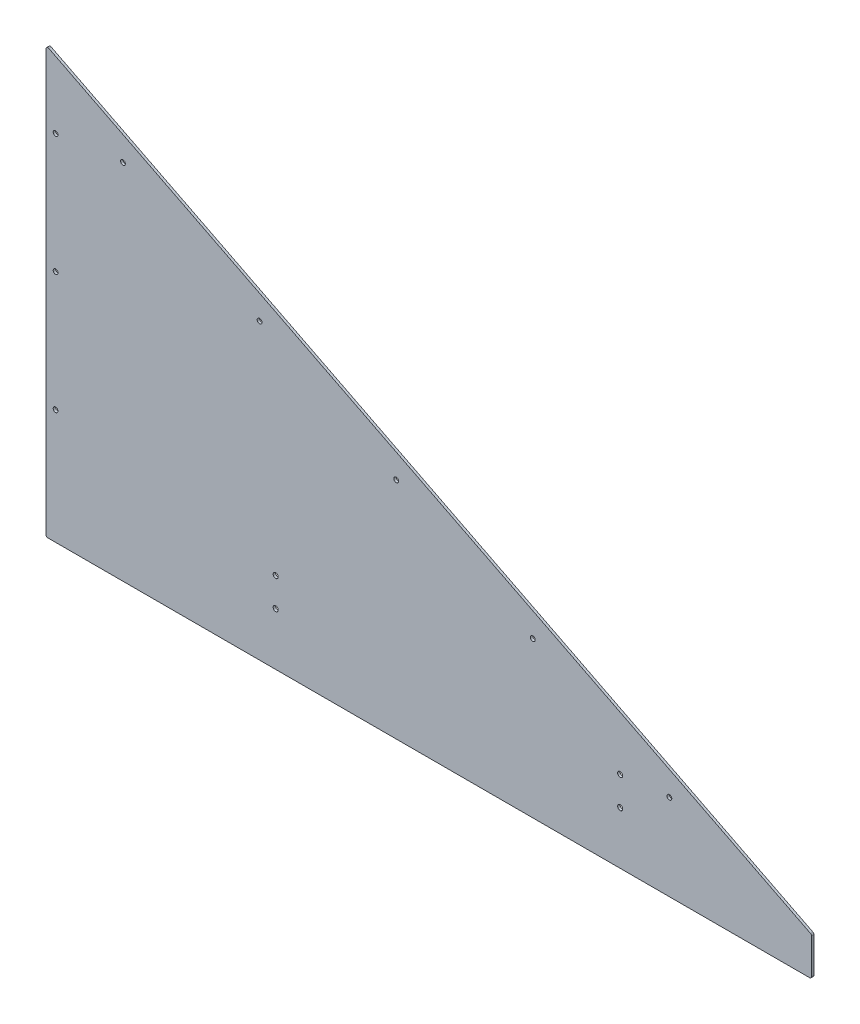
ISO-10303-21;
HEADER;
FILE_DESCRIPTION(('STEP AP214'),'2;1');
FILE_NAME('part.step','',(''),(''),'','','');
FILE_SCHEMA(('AUTOMOTIVE_DESIGN { 1 0 10303 214 1 1 1 1 }'));
ENDSEC;
DATA;
#1=APPLICATION_CONTEXT('core data for automotive mechanical design processes');
#2=APPLICATION_PROTOCOL_DEFINITION('international standard','automotive_design',2000,#1);
#3=PRODUCT_CONTEXT('',#1,'mechanical');
#4=PRODUCT('Part','Part','',(#3));
#5=PRODUCT_RELATED_PRODUCT_CATEGORY('part','',(#4));
#6=PRODUCT_DEFINITION_FORMATION('','',#4);
#7=PRODUCT_DEFINITION_CONTEXT('part definition',#1,'design');
#8=PRODUCT_DEFINITION('design','',#6,#7);
#9=PRODUCT_DEFINITION_SHAPE('','',#8);
#10=(LENGTH_UNIT() NAMED_UNIT(*) SI_UNIT(.MILLI.,.METRE.));
#11=(NAMED_UNIT(*) PLANE_ANGLE_UNIT() SI_UNIT($,.RADIAN.));
#12=(NAMED_UNIT(*) SI_UNIT($,.STERADIAN.) SOLID_ANGLE_UNIT());
#13=UNCERTAINTY_MEASURE_WITH_UNIT(LENGTH_MEASURE(1.E-05),#10,'distance_accuracy_value','');
#14=(GEOMETRIC_REPRESENTATION_CONTEXT(3) GLOBAL_UNCERTAINTY_ASSIGNED_CONTEXT((#13)) GLOBAL_UNIT_ASSIGNED_CONTEXT((#10,
#11,#12)) REPRESENTATION_CONTEXT('',''));
#15=CARTESIAN_POINT('',(0.,0.,0.));
#16=DIRECTION('',(0.,0.,1.));
#17=DIRECTION('',(1.,0.,0.));
#18=AXIS2_PLACEMENT_3D('',#15,#16,#17);
#19=CARTESIAN_POINT('',(0.,0.,3.175));
#20=DIRECTION('',(-0.451668961292938,-0.892185602553952,0.));
#21=DIRECTION('',(0.892185602553952,-0.451668961292938,0.));
#22=AXIS2_PLACEMENT_3D('',#19,#20,#21);
#23=PLANE('',#22);
#24=DIRECTION('',(-0.892185602553952,0.451668961292938,0.));
#25=VECTOR('',#24,1.);
#26=CARTESIAN_POINT('',(0.,0.,3.175));
#27=LINE('',#26,#25);
#28=CARTESIAN_POINT('',(-1.39276083831594,0.705085174397443,3.175));
#29=VERTEX_POINT('',#28);
#30=CARTESIAN_POINT('',(-1012.31276083832,512.483335174397,3.175));
#31=VERTEX_POINT('',#30);
#32=EDGE_CURVE('E123',#29,#31,#27,.T.);
#33=ORIENTED_EDGE('',*,*,#32,.F.);
#34=DIRECTION('',(0.,0.,-1.));
#35=VECTOR('',#34,1.);
#36=CARTESIAN_POINT('',(-1.39276083831594,0.705085174397443,3.175));
#37=LINE('',#36,#35);
#38=CARTESIAN_POINT('',(-1.39276083831594,0.705085174397443,0.));
#39=VERTEX_POINT('',#38);
#40=EDGE_CURVE('E107',#29,#39,#37,.T.);
#41=ORIENTED_EDGE('',*,*,#40,.T.);
#42=DIRECTION('',(-0.892185602553952,0.451668961292938,0.));
#43=VECTOR('',#42,1.);
#44=CARTESIAN_POINT('',(0.,0.,0.));
#45=LINE('',#44,#43);
#46=CARTESIAN_POINT('',(-1012.31276083832,512.483335174397,0.));
#47=VERTEX_POINT('',#46);
#48=EDGE_CURVE('E120',#39,#47,#45,.T.);
#49=ORIENTED_EDGE('',*,*,#48,.T.);
#50=DIRECTION('',(0.,0.,-1.));
#51=VECTOR('',#50,1.);
#52=CARTESIAN_POINT('',(-1012.31276083832,512.483335174397,3.175));
#53=LINE('',#52,#51);
#54=EDGE_CURVE('E126',#47,#31,#53,.F.);
#55=ORIENTED_EDGE('',*,*,#54,.T.);
#56=EDGE_LOOP('',(#33,#41,#49,#55));
#57=FACE_BOUND('',#56,.T.);
#58=ADVANCED_FACE('F36',(#57),#23,.F.);
#59=CARTESIAN_POINT('',(-1016.,514.35,3.175));
#60=DIRECTION('',(1.,0.,0.));
#61=DIRECTION('',(0.,0.,-1.));
#62=AXIS2_PLACEMENT_3D('',#59,#60,#61);
#63=PLANE('',#62);
#64=DIRECTION('',(0.,-1.,0.));
#65=VECTOR('',#64,1.);
#66=CARTESIAN_POINT('',(-1016.,514.35,0.));
#67=LINE('',#66,#65);
#68=CARTESIAN_POINT('',(-1016.,510.21718374391,0.));
#69=VERTEX_POINT('',#68);
#70=CARTESIAN_POINT('',(-1016.,-48.26,0.));
#71=VERTEX_POINT('',#70);
#72=EDGE_CURVE('E131',#69,#71,#67,.T.);
#73=ORIENTED_EDGE('',*,*,#72,.T.);
#74=DIRECTION('',(0.,0.,-1.));
#75=VECTOR('',#74,1.);
#76=CARTESIAN_POINT('',(-1016.,-48.26,3.175));
#77=LINE('',#76,#75);
#78=CARTESIAN_POINT('',(-1016.,-48.26,3.175));
#79=VERTEX_POINT('',#78);
#80=EDGE_CURVE('E11',#71,#79,#77,.F.);
#81=ORIENTED_EDGE('',*,*,#80,.T.);
#82=DIRECTION('',(0.,-1.,0.));
#83=VECTOR('',#82,1.);
#84=CARTESIAN_POINT('',(-1016.,514.35,3.175));
#85=LINE('',#84,#83);
#86=CARTESIAN_POINT('',(-1016.,510.21718374391,3.175));
#87=VERTEX_POINT('',#86);
#88=EDGE_CURVE('E190',#87,#79,#85,.T.);
#89=ORIENTED_EDGE('',*,*,#88,.F.);
#90=DIRECTION('',(0.,0.,-1.));
#91=VECTOR('',#90,1.);
#92=CARTESIAN_POINT('',(-1016.,510.21718374391,3.175));
#93=LINE('',#92,#91);
#94=EDGE_CURVE('E45',#87,#69,#93,.T.);
#95=ORIENTED_EDGE('',*,*,#94,.T.);
#96=EDGE_LOOP('',(#73,#81,#89,#95));
#97=FACE_BOUND('',#96,.T.);
#98=ADVANCED_FACE('F188',(#97),#63,.F.);
#99=CARTESIAN_POINT('',(-1016.,-50.8,3.175));
#100=DIRECTION('',(0.,1.,0.));
#101=DIRECTION('',(0.,0.,1.));
#102=AXIS2_PLACEMENT_3D('',#99,#100,#101);
#103=PLANE('',#102);
#104=DIRECTION('',(1.,0.,0.));
#105=VECTOR('',#104,1.);
#106=CARTESIAN_POINT('',(-1016.,-50.8,0.));
#107=LINE('',#106,#105);
#108=CARTESIAN_POINT('',(-1013.46,-50.8,0.));
#109=VERTEX_POINT('',#108);
#110=CARTESIAN_POINT('',(-2.53999999999999,-50.8,0.));
#111=VERTEX_POINT('',#110);
#112=EDGE_CURVE('E138',#109,#111,#107,.T.);
#113=ORIENTED_EDGE('',*,*,#112,.T.);
#114=DIRECTION('',(0.,0.,-1.));
#115=VECTOR('',#114,1.);
#116=CARTESIAN_POINT('',(-2.53999999999999,-50.8,3.175));
#117=LINE('',#116,#115);
#118=CARTESIAN_POINT('',(-2.53999999999999,-50.8,3.175));
#119=VERTEX_POINT('',#118);
#120=EDGE_CURVE('E52',#111,#119,#117,.F.);
#121=ORIENTED_EDGE('',*,*,#120,.T.);
#122=DIRECTION('',(1.,0.,0.));
#123=VECTOR('',#122,1.);
#124=CARTESIAN_POINT('',(-1016.,-50.8,3.175));
#125=LINE('',#124,#123);
#126=CARTESIAN_POINT('',(-1013.46,-50.8,3.175));
#127=VERTEX_POINT('',#126);
#128=EDGE_CURVE('E198',#127,#119,#125,.T.);
#129=ORIENTED_EDGE('',*,*,#128,.F.);
#130=DIRECTION('',(0.,0.,-1.));
#131=VECTOR('',#130,1.);
#132=CARTESIAN_POINT('',(-1013.46,-50.8,3.175));
#133=LINE('',#132,#131);
#134=EDGE_CURVE('E177',#127,#109,#133,.T.);
#135=ORIENTED_EDGE('',*,*,#134,.T.);
#136=EDGE_LOOP('',(#113,#121,#129,#135));
#137=FACE_BOUND('',#136,.T.);
#138=ADVANCED_FACE('F197',(#137),#103,.F.);
#139=CARTESIAN_POINT('',(0.,-50.8,3.175));
#140=DIRECTION('',(-1.,0.,0.));
#141=DIRECTION('',(0.,0.,1.));
#142=AXIS2_PLACEMENT_3D('',#139,#140,#141);
#143=PLANE('',#142);
#144=DIRECTION('',(0.,1.,0.));
#145=VECTOR('',#144,1.);
#146=CARTESIAN_POINT('',(0.,-50.8,0.));
#147=LINE('',#146,#145);
#148=CARTESIAN_POINT('',(0.,-48.26,0.));
#149=VERTEX_POINT('',#148);
#150=CARTESIAN_POINT('',(0.,-1.56106625608959,0.));
#151=VERTEX_POINT('',#150);
#152=EDGE_CURVE('E149',#149,#151,#147,.T.);
#153=ORIENTED_EDGE('',*,*,#152,.T.);
#154=DIRECTION('',(0.,0.,-1.));
#155=VECTOR('',#154,1.);
#156=CARTESIAN_POINT('',(0.,-1.56106625608959,3.175));
#157=LINE('',#156,#155);
#158=CARTESIAN_POINT('',(0.,-1.56106625608959,3.175));
#159=VERTEX_POINT('',#158);
#160=EDGE_CURVE('E108',#151,#159,#157,.F.);
#161=ORIENTED_EDGE('',*,*,#160,.T.);
#162=DIRECTION('',(0.,1.,0.));
#163=VECTOR('',#162,1.);
#164=CARTESIAN_POINT('',(0.,-50.8,3.175));
#165=LINE('',#164,#163);
#166=CARTESIAN_POINT('',(0.,-48.26,3.175));
#167=VERTEX_POINT('',#166);
#168=EDGE_CURVE('E144',#167,#159,#165,.T.);
#169=ORIENTED_EDGE('',*,*,#168,.F.);
#170=DIRECTION('',(0.,0.,-1.));
#171=VECTOR('',#170,1.);
#172=CARTESIAN_POINT('',(0.,-48.26,3.175));
#173=LINE('',#172,#171);
#174=EDGE_CURVE('E114',#167,#149,#173,.T.);
#175=ORIENTED_EDGE('',*,*,#174,.T.);
#176=EDGE_LOOP('',(#153,#161,#169,#175));
#177=FACE_BOUND('',#176,.T.);
#178=ADVANCED_FACE('F296',(#177),#143,.F.);
#179=CARTESIAN_POINT('',(0.,0.,3.175));
#180=DIRECTION('',(0.,0.,1.));
#181=DIRECTION('',(1.,0.,0.));
#182=AXIS2_PLACEMENT_3D('',#179,#180,#181);
#183=PLANE('',#182);
#184=CARTESIAN_POINT('',(-913.86591776772,430.6165317389,3.175));
#185=DIRECTION('',(0.,0.,1.));
#186=DIRECTION('',(1.,0.,0.));
#187=AXIS2_PLACEMENT_3D('',#184,#185,#186);
#188=CIRCLE('',#187,3.17500000000004);
#189=CARTESIAN_POINT('',(-910.690917767719,430.6165317389,3.175));
#190=VERTEX_POINT('',#189);
#191=EDGE_CURVE('E287',#190,#190,#188,.T.);
#192=ORIENTED_EDGE('',*,*,#191,.F.);
#193=EDGE_LOOP('',(#192));
#194=FACE_BOUND('',#193,.T.);
#195=CARTESIAN_POINT('',(-732.573803328756,338.837398804175,3.175));
#196=DIRECTION('',(0.,0.,1.));
#197=DIRECTION('',(1.,0.,0.));
#198=AXIS2_PLACEMENT_3D('',#195,#196,#197);
#199=CIRCLE('',#198,3.17500000000004);
#200=CARTESIAN_POINT('',(-729.398803328756,338.837398804175,3.175));
#201=VERTEX_POINT('',#200);
#202=EDGE_CURVE('E281',#201,#201,#199,.T.);
#203=ORIENTED_EDGE('',*,*,#202,.F.);
#204=EDGE_LOOP('',(#203));
#205=FACE_BOUND('',#204,.T.);
#206=CARTESIAN_POINT('',(-188.697460011867,63.5,3.175));
#207=DIRECTION('',(0.,0.,1.));
#208=DIRECTION('',(1.,0.,0.));
#209=AXIS2_PLACEMENT_3D('',#206,#207,#208);
#210=CIRCLE('',#209,3.17499999999998);
#211=CARTESIAN_POINT('',(-185.522460011867,63.5,3.175));
#212=VERTEX_POINT('',#211);
#213=EDGE_CURVE('E275',#212,#212,#210,.T.);
#214=ORIENTED_EDGE('',*,*,#213,.F.);
#215=EDGE_LOOP('',(#214));
#216=FACE_BOUND('',#215,.T.);
#217=CARTESIAN_POINT('',(-369.98957445083,155.279132934725,3.175));
#218=DIRECTION('',(0.,0.,1.));
#219=DIRECTION('',(1.,0.,0.));
#220=AXIS2_PLACEMENT_3D('',#217,#218,#219);
#221=CIRCLE('',#220,3.17499999999998);
#222=CARTESIAN_POINT('',(-366.81457445083,155.279132934725,3.175));
#223=VERTEX_POINT('',#222);
#224=EDGE_CURVE('E269',#223,#223,#221,.T.);
#225=ORIENTED_EDGE('',*,*,#224,.F.);
#226=EDGE_LOOP('',(#225));
#227=FACE_BOUND('',#226,.T.);
#228=CARTESIAN_POINT('',(-551.281688889793,247.05826586945,3.175));
#229=DIRECTION('',(0.,0.,1.));
#230=DIRECTION('',(1.,0.,0.));
#231=AXIS2_PLACEMENT_3D('',#228,#229,#230);
#232=CIRCLE('',#231,3.17500000000004);
#233=CARTESIAN_POINT('',(-548.106688889793,247.05826586945,3.175));
#234=VERTEX_POINT('',#233);
#235=EDGE_CURVE('E263',#234,#234,#232,.T.);
#236=ORIENTED_EDGE('',*,*,#235,.F.);
#237=EDGE_LOOP('',(#236));
#238=FACE_BOUND('',#237,.T.);
#239=CARTESIAN_POINT('',(-254.,19.0499999998723,3.175));
#240=DIRECTION('',(0.,0.,1.));
#241=DIRECTION('',(1.,0.,0.));
#242=AXIS2_PLACEMENT_3D('',#239,#240,#241);
#243=CIRCLE('',#242,3.373501);
#244=CARTESIAN_POINT('',(-250.626499,19.0499999998723,3.175));
#245=VERTEX_POINT('',#244);
#246=EDGE_CURVE('E256',#245,#245,#243,.T.);
#247=ORIENTED_EDGE('',*,*,#246,.F.);
#248=EDGE_LOOP('',(#247));
#249=FACE_BOUND('',#248,.T.);
#250=CARTESIAN_POINT('',(-711.2,57.1499999998723,3.175));
#251=DIRECTION('',(0.,0.,1.));
#252=DIRECTION('',(1.,0.,0.));
#253=AXIS2_PLACEMENT_3D('',#250,#251,#252);
#254=CIRCLE('',#253,3.373501);
#255=CARTESIAN_POINT('',(-707.826499,57.1499999998723,3.175));
#256=VERTEX_POINT('',#255);
#257=EDGE_CURVE('E248',#256,#256,#254,.T.);
#258=ORIENTED_EDGE('',*,*,#257,.F.);
#259=EDGE_LOOP('',(#258));
#260=FACE_BOUND('',#259,.T.);
#261=CARTESIAN_POINT('',(-711.2,19.0499999998723,3.175));
#262=DIRECTION('',(0.,0.,1.));
#263=DIRECTION('',(1.,0.,0.));
#264=AXIS2_PLACEMENT_3D('',#261,#262,#263);
#265=CIRCLE('',#264,3.373501);
#266=CARTESIAN_POINT('',(-707.826499,19.0499999998723,3.175));
#267=VERTEX_POINT('',#266);
#268=EDGE_CURVE('E240',#267,#267,#265,.T.);
#269=ORIENTED_EDGE('',*,*,#268,.F.);
#270=EDGE_LOOP('',(#269));
#271=FACE_BOUND('',#270,.T.);
#272=CARTESIAN_POINT('',(-254.,57.1499999998723,3.175));
#273=DIRECTION('',(0.,0.,1.));
#274=DIRECTION('',(1.,0.,0.));
#275=AXIS2_PLACEMENT_3D('',#272,#273,#274);
#276=CIRCLE('',#275,3.373501);
#277=CARTESIAN_POINT('',(-250.626499,57.1499999998723,3.175));
#278=VERTEX_POINT('',#277);
#279=EDGE_CURVE('E232',#278,#278,#276,.T.);
#280=ORIENTED_EDGE('',*,*,#279,.F.);
#281=EDGE_LOOP('',(#280));
#282=FACE_BOUND('',#281,.T.);
#283=CARTESIAN_POINT('',(-1003.3,419.1,3.175));
#284=DIRECTION('',(0.,0.,1.));
#285=DIRECTION('',(1.,0.,0.));
#286=AXIS2_PLACEMENT_3D('',#283,#284,#285);
#287=CIRCLE('',#286,3.17499999999993);
#288=CARTESIAN_POINT('',(-1000.125,419.1,3.175));
#289=VERTEX_POINT('',#288);
#290=EDGE_CURVE('E224',#289,#289,#287,.T.);
#291=ORIENTED_EDGE('',*,*,#290,.F.);
#292=EDGE_LOOP('',(#291));
#293=FACE_BOUND('',#292,.T.);
#294=CARTESIAN_POINT('',(-1003.3,260.35,3.175));
#295=DIRECTION('',(0.,0.,1.));
#296=DIRECTION('',(1.,0.,0.));
#297=AXIS2_PLACEMENT_3D('',#294,#295,#296);
#298=CIRCLE('',#297,3.17499999999993);
#299=CARTESIAN_POINT('',(-1000.125,260.35,3.175));
#300=VERTEX_POINT('',#299);
#301=EDGE_CURVE('E216',#300,#300,#298,.T.);
#302=ORIENTED_EDGE('',*,*,#301,.F.);
#303=EDGE_LOOP('',(#302));
#304=FACE_BOUND('',#303,.T.);
#305=CARTESIAN_POINT('',(-1003.3,101.6,3.175));
#306=DIRECTION('',(0.,0.,1.));
#307=DIRECTION('',(1.,0.,0.));
#308=AXIS2_PLACEMENT_3D('',#305,#306,#307);
#309=CIRCLE('',#308,3.17499999999993);
#310=CARTESIAN_POINT('',(-1000.125,101.6,3.175));
#311=VERTEX_POINT('',#310);
#312=EDGE_CURVE('E141',#311,#311,#309,.T.);
#313=ORIENTED_EDGE('',*,*,#312,.F.);
#314=EDGE_LOOP('',(#313));
#315=FACE_BOUND('',#314,.T.);
#316=ORIENTED_EDGE('',*,*,#168,.T.);
#317=CARTESIAN_POINT('',(-2.54,-1.56106625608959,3.175));
#318=DIRECTION('',(0.,0.,1.));
#319=DIRECTION('',(1.,0.,0.));
#320=AXIS2_PLACEMENT_3D('',#317,#318,#319);
#321=CIRCLE('',#320,2.54);
#322=EDGE_CURVE('E174',#159,#29,#321,.T.);
#323=ORIENTED_EDGE('',*,*,#322,.T.);
#324=ORIENTED_EDGE('',*,*,#32,.T.);
#325=CARTESIAN_POINT('',(-1013.46,510.21718374391,3.175));
#326=DIRECTION('',(0.,0.,1.));
#327=DIRECTION('',(1.,0.,0.));
#328=AXIS2_PLACEMENT_3D('',#325,#326,#327);
#329=CIRCLE('',#328,2.54);
#330=EDGE_CURVE('E166',#31,#87,#329,.T.);
#331=ORIENTED_EDGE('',*,*,#330,.T.);
#332=ORIENTED_EDGE('',*,*,#88,.T.);
#333=CARTESIAN_POINT('',(-1013.46,-48.26,3.175));
#334=DIRECTION('',(0.,0.,1.));
#335=DIRECTION('',(1.,0.,0.));
#336=AXIS2_PLACEMENT_3D('',#333,#334,#335);
#337=CIRCLE('',#336,2.54);
#338=EDGE_CURVE('E59',#79,#127,#337,.T.);
#339=ORIENTED_EDGE('',*,*,#338,.T.);
#340=ORIENTED_EDGE('',*,*,#128,.T.);
#341=CARTESIAN_POINT('',(-2.54,-48.26,3.175));
#342=DIRECTION('',(0.,0.,1.));
#343=DIRECTION('',(1.,0.,0.));
#344=AXIS2_PLACEMENT_3D('',#341,#342,#343);
#345=CIRCLE('',#344,2.54);
#346=EDGE_CURVE('E171',#119,#167,#345,.T.);
#347=ORIENTED_EDGE('',*,*,#346,.T.);
#348=EDGE_LOOP('',(#316,#323,#324,#331,#332,#339,#340,#347));
#349=FACE_BOUND('',#348,.T.);
#350=ADVANCED_FACE('F293',(#194,#205,#216,#227,#238,#249,#260,#271,#282,#293,#304,#315,#349),
#183,.T.);
#351=CARTESIAN_POINT('',(0.,0.,0.));
#352=DIRECTION('',(0.,0.,1.));
#353=DIRECTION('',(1.,0.,0.));
#354=AXIS2_PLACEMENT_3D('',#351,#352,#353);
#355=PLANE('',#354);
#356=CARTESIAN_POINT('',(-913.86591776772,430.6165317389,0.));
#357=DIRECTION('',(0.,0.,1.));
#358=DIRECTION('',(1.,0.,0.));
#359=AXIS2_PLACEMENT_3D('',#356,#357,#358);
#360=CIRCLE('',#359,3.17500000000004);
#361=CARTESIAN_POINT('',(-910.690917767719,430.6165317389,0.));
#362=VERTEX_POINT('',#361);
#363=EDGE_CURVE('E284',#362,#362,#360,.T.);
#364=ORIENTED_EDGE('',*,*,#363,.T.);
#365=EDGE_LOOP('',(#364));
#366=FACE_BOUND('',#365,.T.);
#367=CARTESIAN_POINT('',(-732.573803328756,338.837398804175,0.));
#368=DIRECTION('',(0.,0.,1.));
#369=DIRECTION('',(1.,0.,0.));
#370=AXIS2_PLACEMENT_3D('',#367,#368,#369);
#371=CIRCLE('',#370,3.17500000000004);
#372=CARTESIAN_POINT('',(-729.398803328756,338.837398804175,0.));
#373=VERTEX_POINT('',#372);
#374=EDGE_CURVE('E278',#373,#373,#371,.T.);
#375=ORIENTED_EDGE('',*,*,#374,.T.);
#376=EDGE_LOOP('',(#375));
#377=FACE_BOUND('',#376,.T.);
#378=CARTESIAN_POINT('',(-188.697460011867,63.5,0.));
#379=DIRECTION('',(0.,0.,1.));
#380=DIRECTION('',(1.,0.,0.));
#381=AXIS2_PLACEMENT_3D('',#378,#379,#380);
#382=CIRCLE('',#381,3.175);
#383=CARTESIAN_POINT('',(-185.522460011867,63.5,0.));
#384=VERTEX_POINT('',#383);
#385=EDGE_CURVE('E272',#384,#384,#382,.T.);
#386=ORIENTED_EDGE('',*,*,#385,.T.);
#387=EDGE_LOOP('',(#386));
#388=FACE_BOUND('',#387,.T.);
#389=CARTESIAN_POINT('',(-369.98957445083,155.279132934725,0.));
#390=DIRECTION('',(0.,0.,1.));
#391=DIRECTION('',(1.,0.,0.));
#392=AXIS2_PLACEMENT_3D('',#389,#390,#391);
#393=CIRCLE('',#392,3.17499999999998);
#394=CARTESIAN_POINT('',(-366.81457445083,155.279132934725,0.));
#395=VERTEX_POINT('',#394);
#396=EDGE_CURVE('E266',#395,#395,#393,.T.);
#397=ORIENTED_EDGE('',*,*,#396,.T.);
#398=EDGE_LOOP('',(#397));
#399=FACE_BOUND('',#398,.T.);
#400=CARTESIAN_POINT('',(-551.281688889793,247.05826586945,0.));
#401=DIRECTION('',(0.,0.,1.));
#402=DIRECTION('',(1.,0.,0.));
#403=AXIS2_PLACEMENT_3D('',#400,#401,#402);
#404=CIRCLE('',#403,3.17500000000004);
#405=CARTESIAN_POINT('',(-548.106688889793,247.05826586945,0.));
#406=VERTEX_POINT('',#405);
#407=EDGE_CURVE('E260',#406,#406,#404,.T.);
#408=ORIENTED_EDGE('',*,*,#407,.T.);
#409=EDGE_LOOP('',(#408));
#410=FACE_BOUND('',#409,.T.);
#411=CARTESIAN_POINT('',(-254.,19.0499999998723,0.));
#412=DIRECTION('',(0.,0.,1.));
#413=DIRECTION('',(1.,0.,0.));
#414=AXIS2_PLACEMENT_3D('',#411,#412,#413);
#415=CIRCLE('',#414,3.373501);
#416=CARTESIAN_POINT('',(-250.626499,19.0499999998723,0.));
#417=VERTEX_POINT('',#416);
#418=EDGE_CURVE('E252',#417,#417,#415,.T.);
#419=ORIENTED_EDGE('',*,*,#418,.T.);
#420=EDGE_LOOP('',(#419));
#421=FACE_BOUND('',#420,.T.);
#422=CARTESIAN_POINT('',(-711.2,57.1499999998723,0.));
#423=DIRECTION('',(0.,0.,1.));
#424=DIRECTION('',(1.,0.,0.));
#425=AXIS2_PLACEMENT_3D('',#422,#423,#424);
#426=CIRCLE('',#425,3.373501);
#427=CARTESIAN_POINT('',(-707.826499,57.1499999998723,0.));
#428=VERTEX_POINT('',#427);
#429=EDGE_CURVE('E244',#428,#428,#426,.T.);
#430=ORIENTED_EDGE('',*,*,#429,.T.);
#431=EDGE_LOOP('',(#430));
#432=FACE_BOUND('',#431,.T.);
#433=CARTESIAN_POINT('',(-711.2,19.0499999998723,0.));
#434=DIRECTION('',(0.,0.,1.));
#435=DIRECTION('',(1.,0.,0.));
#436=AXIS2_PLACEMENT_3D('',#433,#434,#435);
#437=CIRCLE('',#436,3.373501);
#438=CARTESIAN_POINT('',(-707.826499,19.0499999998723,0.));
#439=VERTEX_POINT('',#438);
#440=EDGE_CURVE('E236',#439,#439,#437,.T.);
#441=ORIENTED_EDGE('',*,*,#440,.T.);
#442=EDGE_LOOP('',(#441));
#443=FACE_BOUND('',#442,.T.);
#444=CARTESIAN_POINT('',(-254.,57.1499999998723,0.));
#445=DIRECTION('',(0.,0.,1.));
#446=DIRECTION('',(1.,0.,0.));
#447=AXIS2_PLACEMENT_3D('',#444,#445,#446);
#448=CIRCLE('',#447,3.373501);
#449=CARTESIAN_POINT('',(-250.626499,57.1499999998723,0.));
#450=VERTEX_POINT('',#449);
#451=EDGE_CURVE('E228',#450,#450,#448,.T.);
#452=ORIENTED_EDGE('',*,*,#451,.T.);
#453=EDGE_LOOP('',(#452));
#454=FACE_BOUND('',#453,.T.);
#455=CARTESIAN_POINT('',(-1003.3,419.1,0.));
#456=DIRECTION('',(0.,0.,1.));
#457=DIRECTION('',(1.,0.,0.));
#458=AXIS2_PLACEMENT_3D('',#455,#456,#457);
#459=CIRCLE('',#458,3.17499999999993);
#460=CARTESIAN_POINT('',(-1000.125,419.1,0.));
#461=VERTEX_POINT('',#460);
#462=EDGE_CURVE('E220',#461,#461,#459,.T.);
#463=ORIENTED_EDGE('',*,*,#462,.T.);
#464=EDGE_LOOP('',(#463));
#465=FACE_BOUND('',#464,.T.);
#466=CARTESIAN_POINT('',(-1003.3,260.35,0.));
#467=DIRECTION('',(0.,0.,1.));
#468=DIRECTION('',(1.,0.,0.));
#469=AXIS2_PLACEMENT_3D('',#466,#467,#468);
#470=CIRCLE('',#469,3.17499999999993);
#471=CARTESIAN_POINT('',(-1000.125,260.35,0.));
#472=VERTEX_POINT('',#471);
#473=EDGE_CURVE('E212',#472,#472,#470,.T.);
#474=ORIENTED_EDGE('',*,*,#473,.T.);
#475=EDGE_LOOP('',(#474));
#476=FACE_BOUND('',#475,.T.);
#477=CARTESIAN_POINT('',(-1003.3,101.6,0.));
#478=DIRECTION('',(0.,0.,1.));
#479=DIRECTION('',(1.,0.,0.));
#480=AXIS2_PLACEMENT_3D('',#477,#478,#479);
#481=CIRCLE('',#480,3.17499999999993);
#482=CARTESIAN_POINT('',(-1000.125,101.6,0.));
#483=VERTEX_POINT('',#482);
#484=EDGE_CURVE('E132',#483,#483,#481,.T.);
#485=ORIENTED_EDGE('',*,*,#484,.T.);
#486=EDGE_LOOP('',(#485));
#487=FACE_BOUND('',#486,.T.);
#488=ORIENTED_EDGE('',*,*,#48,.F.);
#489=CARTESIAN_POINT('',(-2.54,-1.56106625608959,0.));
#490=DIRECTION('',(0.,0.,1.));
#491=DIRECTION('',(1.,0.,0.));
#492=AXIS2_PLACEMENT_3D('',#489,#490,#491);
#493=CIRCLE('',#492,2.54);
#494=EDGE_CURVE('E103',#39,#151,#493,.F.);
#495=ORIENTED_EDGE('',*,*,#494,.T.);
#496=ORIENTED_EDGE('',*,*,#152,.F.);
#497=CARTESIAN_POINT('',(-2.54,-48.26,0.));
#498=DIRECTION('',(0.,0.,1.));
#499=DIRECTION('',(1.,0.,0.));
#500=AXIS2_PLACEMENT_3D('',#497,#498,#499);
#501=CIRCLE('',#500,2.54);
#502=EDGE_CURVE('E115',#149,#111,#501,.F.);
#503=ORIENTED_EDGE('',*,*,#502,.T.);
#504=ORIENTED_EDGE('',*,*,#112,.F.);
#505=CARTESIAN_POINT('',(-1013.46,-48.26,0.));
#506=DIRECTION('',(0.,0.,1.));
#507=DIRECTION('',(1.,0.,0.));
#508=AXIS2_PLACEMENT_3D('',#505,#506,#507);
#509=CIRCLE('',#508,2.54);
#510=EDGE_CURVE('E156',#109,#71,#509,.F.);
#511=ORIENTED_EDGE('',*,*,#510,.T.);
#512=ORIENTED_EDGE('',*,*,#72,.F.);
#513=CARTESIAN_POINT('',(-1013.46,510.21718374391,0.));
#514=DIRECTION('',(0.,0.,1.));
#515=DIRECTION('',(1.,0.,0.));
#516=AXIS2_PLACEMENT_3D('',#513,#514,#515);
#517=CIRCLE('',#516,2.54);
#518=EDGE_CURVE('E125',#69,#47,#517,.F.);
#519=ORIENTED_EDGE('',*,*,#518,.T.);
#520=EDGE_LOOP('',(#488,#495,#496,#503,#504,#511,#512,#519));
#521=FACE_BOUND('',#520,.T.);
#522=ADVANCED_FACE('F128',(#366,#377,#388,#399,#410,#421,#432,#443,#454,#465,#476,#487,#521),
#355,.F.);
#523=CARTESIAN_POINT('',(-1003.3,101.6,3.175));
#524=DIRECTION('',(0.,0.,1.));
#525=DIRECTION('',(1.,0.,0.));
#526=AXIS2_PLACEMENT_3D('',#523,#524,#525);
#527=CYLINDRICAL_SURFACE('',#526,3.17499999999993);
#528=ORIENTED_EDGE('',*,*,#484,.F.);
#529=EDGE_LOOP('',(#528));
#530=FACE_BOUND('',#529,.T.);
#531=ORIENTED_EDGE('',*,*,#312,.T.);
#532=EDGE_LOOP('',(#531));
#533=FACE_BOUND('',#532,.T.);
#534=ADVANCED_FACE('F344',(#530,#533),#527,.F.);
#535=CARTESIAN_POINT('',(-1003.3,260.35,3.175));
#536=DIRECTION('',(0.,0.,1.));
#537=DIRECTION('',(1.,0.,0.));
#538=AXIS2_PLACEMENT_3D('',#535,#536,#537);
#539=CYLINDRICAL_SURFACE('',#538,3.17499999999993);
#540=ORIENTED_EDGE('',*,*,#473,.F.);
#541=EDGE_LOOP('',(#540));
#542=FACE_BOUND('',#541,.T.);
#543=ORIENTED_EDGE('',*,*,#301,.T.);
#544=EDGE_LOOP('',(#543));
#545=FACE_BOUND('',#544,.T.);
#546=ADVANCED_FACE('F349',(#542,#545),#539,.F.);
#547=CARTESIAN_POINT('',(-1003.3,419.1,3.175));
#548=DIRECTION('',(0.,0.,1.));
#549=DIRECTION('',(1.,0.,0.));
#550=AXIS2_PLACEMENT_3D('',#547,#548,#549);
#551=CYLINDRICAL_SURFACE('',#550,3.17499999999993);
#552=ORIENTED_EDGE('',*,*,#462,.F.);
#553=EDGE_LOOP('',(#552));
#554=FACE_BOUND('',#553,.T.);
#555=ORIENTED_EDGE('',*,*,#290,.T.);
#556=EDGE_LOOP('',(#555));
#557=FACE_BOUND('',#556,.T.);
#558=ADVANCED_FACE('F353',(#554,#557),#551,.F.);
#559=CARTESIAN_POINT('',(-254.,57.1499999998723,3.175));
#560=DIRECTION('',(0.,0.,1.));
#561=DIRECTION('',(1.,0.,0.));
#562=AXIS2_PLACEMENT_3D('',#559,#560,#561);
#563=CYLINDRICAL_SURFACE('',#562,3.373501);
#564=ORIENTED_EDGE('',*,*,#451,.F.);
#565=EDGE_LOOP('',(#564));
#566=FACE_BOUND('',#565,.T.);
#567=ORIENTED_EDGE('',*,*,#279,.T.);
#568=EDGE_LOOP('',(#567));
#569=FACE_BOUND('',#568,.T.);
#570=ADVANCED_FACE('F357',(#566,#569),#563,.F.);
#571=CARTESIAN_POINT('',(-711.2,19.0499999998723,3.175));
#572=DIRECTION('',(0.,0.,1.));
#573=DIRECTION('',(1.,0.,0.));
#574=AXIS2_PLACEMENT_3D('',#571,#572,#573);
#575=CYLINDRICAL_SURFACE('',#574,3.373501);
#576=ORIENTED_EDGE('',*,*,#440,.F.);
#577=EDGE_LOOP('',(#576));
#578=FACE_BOUND('',#577,.T.);
#579=ORIENTED_EDGE('',*,*,#268,.T.);
#580=EDGE_LOOP('',(#579));
#581=FACE_BOUND('',#580,.T.);
#582=ADVANCED_FACE('F361',(#578,#581),#575,.F.);
#583=CARTESIAN_POINT('',(-711.2,57.1499999998723,3.175));
#584=DIRECTION('',(0.,0.,1.));
#585=DIRECTION('',(1.,0.,0.));
#586=AXIS2_PLACEMENT_3D('',#583,#584,#585);
#587=CYLINDRICAL_SURFACE('',#586,3.373501);
#588=ORIENTED_EDGE('',*,*,#429,.F.);
#589=EDGE_LOOP('',(#588));
#590=FACE_BOUND('',#589,.T.);
#591=ORIENTED_EDGE('',*,*,#257,.T.);
#592=EDGE_LOOP('',(#591));
#593=FACE_BOUND('',#592,.T.);
#594=ADVANCED_FACE('F365',(#590,#593),#587,.F.);
#595=CARTESIAN_POINT('',(-254.,19.0499999998723,3.175));
#596=DIRECTION('',(0.,0.,1.));
#597=DIRECTION('',(1.,0.,0.));
#598=AXIS2_PLACEMENT_3D('',#595,#596,#597);
#599=CYLINDRICAL_SURFACE('',#598,3.373501);
#600=ORIENTED_EDGE('',*,*,#418,.F.);
#601=EDGE_LOOP('',(#600));
#602=FACE_BOUND('',#601,.T.);
#603=ORIENTED_EDGE('',*,*,#246,.T.);
#604=EDGE_LOOP('',(#603));
#605=FACE_BOUND('',#604,.T.);
#606=ADVANCED_FACE('F330',(#602,#605),#599,.F.);
#607=CARTESIAN_POINT('',(-2.54,-1.56106625608959,3.175));
#608=DIRECTION('',(0.,0.,-1.));
#609=DIRECTION('',(-1.,0.,0.));
#610=AXIS2_PLACEMENT_3D('',#607,#608,#609);
#611=CYLINDRICAL_SURFACE('',#610,2.54);
#612=ORIENTED_EDGE('',*,*,#322,.F.);
#613=ORIENTED_EDGE('',*,*,#160,.F.);
#614=ORIENTED_EDGE('',*,*,#494,.F.);
#615=ORIENTED_EDGE('',*,*,#40,.F.);
#616=EDGE_LOOP('',(#612,#613,#614,#615));
#617=FACE_BOUND('',#616,.T.);
#618=ADVANCED_FACE('F106',(#617),#611,.T.);
#619=CARTESIAN_POINT('',(-2.54,-48.26,3.175));
#620=DIRECTION('',(0.,0.,-1.));
#621=DIRECTION('',(-1.,0.,0.));
#622=AXIS2_PLACEMENT_3D('',#619,#620,#621);
#623=CYLINDRICAL_SURFACE('',#622,2.54);
#624=ORIENTED_EDGE('',*,*,#346,.F.);
#625=ORIENTED_EDGE('',*,*,#120,.F.);
#626=ORIENTED_EDGE('',*,*,#502,.F.);
#627=ORIENTED_EDGE('',*,*,#174,.F.);
#628=EDGE_LOOP('',(#624,#625,#626,#627));
#629=FACE_BOUND('',#628,.T.);
#630=ADVANCED_FACE('F323',(#629),#623,.T.);
#631=CARTESIAN_POINT('',(-1013.46,-48.26,3.175));
#632=DIRECTION('',(0.,0.,-1.));
#633=DIRECTION('',(-1.,0.,0.));
#634=AXIS2_PLACEMENT_3D('',#631,#632,#633);
#635=CYLINDRICAL_SURFACE('',#634,2.54);
#636=ORIENTED_EDGE('',*,*,#338,.F.);
#637=ORIENTED_EDGE('',*,*,#80,.F.);
#638=ORIENTED_EDGE('',*,*,#510,.F.);
#639=ORIENTED_EDGE('',*,*,#134,.F.);
#640=EDGE_LOOP('',(#636,#637,#638,#639));
#641=FACE_BOUND('',#640,.T.);
#642=ADVANCED_FACE('F196',(#641),#635,.T.);
#643=CARTESIAN_POINT('',(-1013.46,510.21718374391,3.175));
#644=DIRECTION('',(0.,0.,-1.));
#645=DIRECTION('',(-1.,0.,0.));
#646=AXIS2_PLACEMENT_3D('',#643,#644,#645);
#647=CYLINDRICAL_SURFACE('',#646,2.54);
#648=ORIENTED_EDGE('',*,*,#330,.F.);
#649=ORIENTED_EDGE('',*,*,#54,.F.);
#650=ORIENTED_EDGE('',*,*,#518,.F.);
#651=ORIENTED_EDGE('',*,*,#94,.F.);
#652=EDGE_LOOP('',(#648,#649,#650,#651));
#653=FACE_BOUND('',#652,.T.);
#654=ADVANCED_FACE('F38',(#653),#647,.T.);
#655=CARTESIAN_POINT('',(-551.281688889793,247.05826586945,3.175));
#656=DIRECTION('',(0.,0.,1.));
#657=DIRECTION('',(1.,0.,0.));
#658=AXIS2_PLACEMENT_3D('',#655,#656,#657);
#659=CYLINDRICAL_SURFACE('',#658,3.17500000000004);
#660=ORIENTED_EDGE('',*,*,#407,.F.);
#661=EDGE_LOOP('',(#660));
#662=FACE_BOUND('',#661,.T.);
#663=ORIENTED_EDGE('',*,*,#235,.T.);
#664=EDGE_LOOP('',(#663));
#665=FACE_BOUND('',#664,.T.);
#666=ADVANCED_FACE('F373',(#662,#665),#659,.F.);
#667=CARTESIAN_POINT('',(-369.98957445083,155.279132934725,3.175));
#668=DIRECTION('',(0.,0.,1.));
#669=DIRECTION('',(1.,0.,0.));
#670=AXIS2_PLACEMENT_3D('',#667,#668,#669);
#671=CYLINDRICAL_SURFACE('',#670,3.17499999999998);
#672=ORIENTED_EDGE('',*,*,#396,.F.);
#673=EDGE_LOOP('',(#672));
#674=FACE_BOUND('',#673,.T.);
#675=ORIENTED_EDGE('',*,*,#224,.T.);
#676=EDGE_LOOP('',(#675));
#677=FACE_BOUND('',#676,.T.);
#678=ADVANCED_FACE('F376',(#674,#677),#671,.F.);
#679=CARTESIAN_POINT('',(-188.697460011867,63.5,3.175));
#680=DIRECTION('',(0.,0.,1.));
#681=DIRECTION('',(1.,0.,0.));
#682=AXIS2_PLACEMENT_3D('',#679,#680,#681);
#683=CYLINDRICAL_SURFACE('',#682,3.175);
#684=ORIENTED_EDGE('',*,*,#385,.F.);
#685=EDGE_LOOP('',(#684));
#686=FACE_BOUND('',#685,.T.);
#687=ORIENTED_EDGE('',*,*,#213,.T.);
#688=EDGE_LOOP('',(#687));
#689=FACE_BOUND('',#688,.T.);
#690=ADVANCED_FACE('F380',(#686,#689),#683,.F.);
#691=CARTESIAN_POINT('',(-732.573803328756,338.837398804175,3.175));
#692=DIRECTION('',(0.,0.,1.));
#693=DIRECTION('',(1.,0.,0.));
#694=AXIS2_PLACEMENT_3D('',#691,#692,#693);
#695=CYLINDRICAL_SURFACE('',#694,3.17500000000004);
#696=ORIENTED_EDGE('',*,*,#374,.F.);
#697=EDGE_LOOP('',(#696));
#698=FACE_BOUND('',#697,.T.);
#699=ORIENTED_EDGE('',*,*,#202,.T.);
#700=EDGE_LOOP('',(#699));
#701=FACE_BOUND('',#700,.T.);
#702=ADVANCED_FACE('F384',(#698,#701),#695,.F.);
#703=CARTESIAN_POINT('',(-913.86591776772,430.6165317389,3.175));
#704=DIRECTION('',(0.,0.,1.));
#705=DIRECTION('',(1.,0.,0.));
#706=AXIS2_PLACEMENT_3D('',#703,#704,#705);
#707=CYLINDRICAL_SURFACE('',#706,3.17500000000004);
#708=ORIENTED_EDGE('',*,*,#363,.F.);
#709=EDGE_LOOP('',(#708));
#710=FACE_BOUND('',#709,.T.);
#711=ORIENTED_EDGE('',*,*,#191,.T.);
#712=EDGE_LOOP('',(#711));
#713=FACE_BOUND('',#712,.T.);
#714=ADVANCED_FACE('F291',(#710,#713),#707,.F.);
#715=CLOSED_SHELL('',(#58,#98,#138,#178,#350,#522,#534,#546,#558,#570,#582,#594,#606,#618,#630,
#642,#654,#666,#678,#690,#702,#714));
#716=MANIFOLD_SOLID_BREP('B2',#715);
#717=ADVANCED_BREP_SHAPE_REPRESENTATION('',(#18,#716),#14);
#718=SHAPE_DEFINITION_REPRESENTATION(#9,#717);
ENDSEC;
END-ISO-10303-21;
